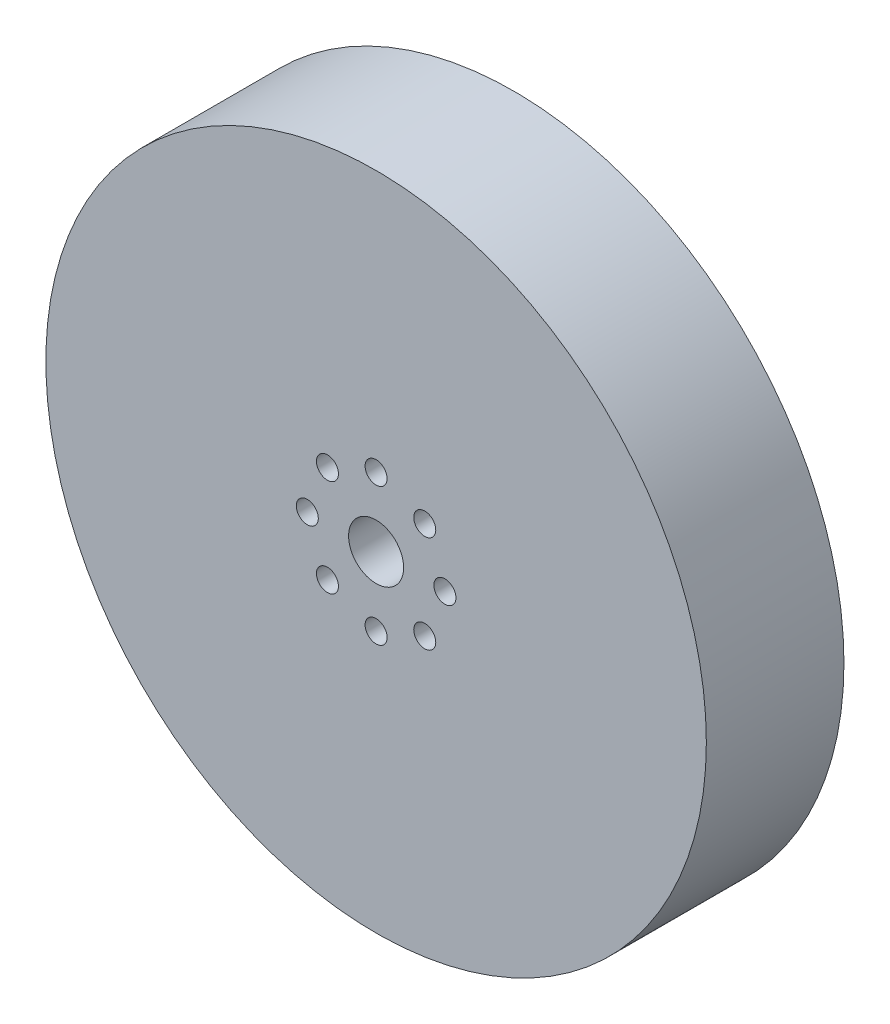
ISO-10303-21;
HEADER;
FILE_DESCRIPTION(('STEP AP214'),'2;1');
FILE_NAME('part.step','',(''),(''),'','','');
FILE_SCHEMA(('AUTOMOTIVE_DESIGN { 1 0 10303 214 1 1 1 1 }'));
ENDSEC;
DATA;
#1=APPLICATION_CONTEXT('core data for automotive mechanical design processes');
#2=APPLICATION_PROTOCOL_DEFINITION('international standard','automotive_design',2000,#1);
#3=PRODUCT_CONTEXT('',#1,'mechanical');
#4=PRODUCT('Part','Part','',(#3));
#5=PRODUCT_RELATED_PRODUCT_CATEGORY('part','',(#4));
#6=PRODUCT_DEFINITION_FORMATION('','',#4);
#7=PRODUCT_DEFINITION_CONTEXT('part definition',#1,'design');
#8=PRODUCT_DEFINITION('design','',#6,#7);
#9=PRODUCT_DEFINITION_SHAPE('','',#8);
#10=(LENGTH_UNIT() NAMED_UNIT(*) SI_UNIT(.MILLI.,.METRE.));
#11=(NAMED_UNIT(*) PLANE_ANGLE_UNIT() SI_UNIT($,.RADIAN.));
#12=(NAMED_UNIT(*) SI_UNIT($,.STERADIAN.) SOLID_ANGLE_UNIT());
#13=UNCERTAINTY_MEASURE_WITH_UNIT(LENGTH_MEASURE(1.E-05),#10,'distance_accuracy_value','');
#14=(GEOMETRIC_REPRESENTATION_CONTEXT(3) GLOBAL_UNCERTAINTY_ASSIGNED_CONTEXT((#13)) GLOBAL_UNIT_ASSIGNED_CONTEXT((#10,
#11,#12)) REPRESENTATION_CONTEXT('',''));
#15=CARTESIAN_POINT('',(0.,0.,0.));
#16=DIRECTION('',(0.,0.,1.));
#17=DIRECTION('',(1.,0.,0.));
#18=AXIS2_PLACEMENT_3D('',#15,#16,#17);
#19=CARTESIAN_POINT('',(0.,0.,20.));
#20=DIRECTION('',(0.,0.,-1.));
#21=DIRECTION('',(-1.,0.,0.));
#22=AXIS2_PLACEMENT_3D('',#19,#20,#21);
#23=CYLINDRICAL_SURFACE('',#22,48.);
#24=CARTESIAN_POINT('',(0.,0.,20.));
#25=DIRECTION('',(0.,0.,1.));
#26=DIRECTION('',(1.,0.,0.));
#27=AXIS2_PLACEMENT_3D('',#24,#25,#26);
#28=CIRCLE('',#27,48.);
#29=CARTESIAN_POINT('',(48.,0.,20.));
#30=VERTEX_POINT('',#29);
#31=EDGE_CURVE('E10',#30,#30,#28,.T.);
#32=ORIENTED_EDGE('',*,*,#31,.F.);
#33=EDGE_LOOP('',(#32));
#34=FACE_BOUND('',#33,.T.);
#35=CARTESIAN_POINT('',(0.,0.,0.));
#36=DIRECTION('',(0.,0.,1.));
#37=DIRECTION('',(1.,0.,0.));
#38=AXIS2_PLACEMENT_3D('',#35,#36,#37);
#39=CIRCLE('',#38,48.);
#40=CARTESIAN_POINT('',(48.,0.,0.));
#41=VERTEX_POINT('',#40);
#42=EDGE_CURVE('E34',#41,#41,#39,.T.);
#43=ORIENTED_EDGE('',*,*,#42,.T.);
#44=EDGE_LOOP('',(#43));
#45=FACE_BOUND('',#44,.T.);
#46=ADVANCED_FACE('F31',(#34,#45),#23,.T.);
#47=CARTESIAN_POINT('',(0.,0.,20.));
#48=DIRECTION('',(0.,0.,1.));
#49=DIRECTION('',(1.,0.,0.));
#50=AXIS2_PLACEMENT_3D('',#47,#48,#49);
#51=PLANE('',#50);
#52=CARTESIAN_POINT('',(0.,10.,20.));
#53=DIRECTION('',(0.,0.,1.));
#54=DIRECTION('',(1.,0.,0.));
#55=AXIS2_PLACEMENT_3D('',#52,#53,#54);
#56=CIRCLE('',#55,1.6);
#57=CARTESIAN_POINT('',(1.6,10.,20.));
#58=VERTEX_POINT('',#57);
#59=EDGE_CURVE('E68',#58,#58,#56,.F.);
#60=ORIENTED_EDGE('',*,*,#59,.T.);
#61=EDGE_LOOP('',(#60));
#62=FACE_BOUND('',#61,.T.);
#63=CARTESIAN_POINT('',(-7.07106781186563,7.07106781186584,20.));
#64=DIRECTION('',(0.,0.,1.));
#65=DIRECTION('',(1.,0.,0.));
#66=AXIS2_PLACEMENT_3D('',#63,#64,#65);
#67=CIRCLE('',#66,1.6);
#68=CARTESIAN_POINT('',(-5.47106781186562,7.07106781186584,20.));
#69=VERTEX_POINT('',#68);
#70=EDGE_CURVE('E62',#69,#69,#67,.F.);
#71=ORIENTED_EDGE('',*,*,#70,.T.);
#72=EDGE_LOOP('',(#71));
#73=FACE_BOUND('',#72,.T.);
#74=CARTESIAN_POINT('',(-10.0000000000005,5.16132801497635E-13,20.));
#75=DIRECTION('',(0.,0.,1.));
#76=DIRECTION('',(1.,0.,0.));
#77=AXIS2_PLACEMENT_3D('',#74,#75,#76);
#78=CIRCLE('',#77,1.6);
#79=CARTESIAN_POINT('',(-8.40000000000051,5.16132801497635E-13,20.));
#80=VERTEX_POINT('',#79);
#81=EDGE_CURVE('E56',#80,#80,#78,.F.);
#82=ORIENTED_EDGE('',*,*,#81,.T.);
#83=EDGE_LOOP('',(#82));
#84=FACE_BOUND('',#83,.T.);
#85=CARTESIAN_POINT('',(-7.07106781186636,-7.07106781186511,20.));
#86=DIRECTION('',(0.,0.,1.));
#87=DIRECTION('',(1.,0.,0.));
#88=AXIS2_PLACEMENT_3D('',#85,#86,#87);
#89=CIRCLE('',#88,1.6);
#90=CARTESIAN_POINT('',(-5.47106781186636,-7.07106781186511,20.));
#91=VERTEX_POINT('',#90);
#92=EDGE_CURVE('E49',#91,#91,#89,.F.);
#93=ORIENTED_EDGE('',*,*,#92,.T.);
#94=EDGE_LOOP('',(#93));
#95=FACE_BOUND('',#94,.T.);
#96=CARTESIAN_POINT('',(-1.03226560299527E-12,-10.,20.));
#97=DIRECTION('',(0.,0.,1.));
#98=DIRECTION('',(1.,0.,0.));
#99=AXIS2_PLACEMENT_3D('',#96,#97,#98);
#100=CIRCLE('',#99,1.6);
#101=CARTESIAN_POINT('',(1.59999999999897,-10.,20.));
#102=VERTEX_POINT('',#101);
#103=EDGE_CURVE('E91',#102,#102,#100,.F.);
#104=ORIENTED_EDGE('',*,*,#103,.T.);
#105=EDGE_LOOP('',(#104));
#106=FACE_BOUND('',#105,.T.);
#107=CARTESIAN_POINT('',(7.0710678118646,-7.07106781186584,20.));
#108=DIRECTION('',(0.,0.,1.));
#109=DIRECTION('',(1.,0.,0.));
#110=AXIS2_PLACEMENT_3D('',#107,#108,#109);
#111=CIRCLE('',#110,1.6);
#112=CARTESIAN_POINT('',(8.67106781186459,-7.07106781186584,20.));
#113=VERTEX_POINT('',#112);
#114=EDGE_CURVE('E85',#113,#113,#111,.F.);
#115=ORIENTED_EDGE('',*,*,#114,.T.);
#116=EDGE_LOOP('',(#115));
#117=FACE_BOUND('',#116,.T.);
#118=CARTESIAN_POINT('',(9.99999999999948,-5.17357448296783E-13,20.));
#119=DIRECTION('',(0.,0.,1.));
#120=DIRECTION('',(1.,0.,0.));
#121=AXIS2_PLACEMENT_3D('',#118,#119,#120);
#122=CIRCLE('',#121,1.6);
#123=CARTESIAN_POINT('',(11.5999999999995,-5.17357448296783E-13,20.));
#124=VERTEX_POINT('',#123);
#125=EDGE_CURVE('E79',#124,#124,#122,.F.);
#126=ORIENTED_EDGE('',*,*,#125,.T.);
#127=EDGE_LOOP('',(#126));
#128=FACE_BOUND('',#127,.T.);
#129=CARTESIAN_POINT('',(7.07106781186533,7.07106781186511,20.));
#130=DIRECTION('',(0.,0.,1.));
#131=DIRECTION('',(1.,0.,0.));
#132=AXIS2_PLACEMENT_3D('',#129,#130,#131);
#133=CIRCLE('',#132,1.6);
#134=CARTESIAN_POINT('',(8.67106781186533,7.07106781186511,20.));
#135=VERTEX_POINT('',#134);
#136=EDGE_CURVE('E73',#135,#135,#133,.F.);
#137=ORIENTED_EDGE('',*,*,#136,.T.);
#138=EDGE_LOOP('',(#137));
#139=FACE_BOUND('',#138,.T.);
#140=CARTESIAN_POINT('',(0.,0.,20.));
#141=DIRECTION('',(0.,0.,1.));
#142=DIRECTION('',(1.,0.,0.));
#143=AXIS2_PLACEMENT_3D('',#140,#141,#142);
#144=CIRCLE('',#143,4.);
#145=CARTESIAN_POINT('',(4.,0.,20.));
#146=VERTEX_POINT('',#145);
#147=EDGE_CURVE('E43',#146,#146,#144,.F.);
#148=ORIENTED_EDGE('',*,*,#147,.T.);
#149=EDGE_LOOP('',(#148));
#150=FACE_BOUND('',#149,.T.);
#151=ORIENTED_EDGE('',*,*,#31,.T.);
#152=EDGE_LOOP('',(#151));
#153=FACE_BOUND('',#152,.T.);
#154=ADVANCED_FACE('F103',(#62,#73,#84,#95,#106,#117,#128,#139,#150,#153),#51,.T.);
#155=CARTESIAN_POINT('',(0.,0.,0.));
#156=DIRECTION('',(0.,0.,1.));
#157=DIRECTION('',(1.,0.,0.));
#158=AXIS2_PLACEMENT_3D('',#155,#156,#157);
#159=PLANE('',#158);
#160=CARTESIAN_POINT('',(0.,10.,0.));
#161=DIRECTION('',(0.,0.,-1.));
#162=DIRECTION('',(-1.,0.,0.));
#163=AXIS2_PLACEMENT_3D('',#160,#161,#162);
#164=CIRCLE('',#163,1.6);
#165=CARTESIAN_POINT('',(-1.6,10.,0.));
#166=VERTEX_POINT('',#165);
#167=EDGE_CURVE('E46',#166,#166,#164,.T.);
#168=ORIENTED_EDGE('',*,*,#167,.F.);
#169=EDGE_LOOP('',(#168));
#170=FACE_BOUND('',#169,.T.);
#171=CARTESIAN_POINT('',(-7.07106781186563,7.07106781186584,0.));
#172=DIRECTION('',(0.,0.,-1.));
#173=DIRECTION('',(-1.,0.,0.));
#174=AXIS2_PLACEMENT_3D('',#171,#172,#173);
#175=CIRCLE('',#174,1.6);
#176=CARTESIAN_POINT('',(-8.67106781186563,7.07106781186584,0.));
#177=VERTEX_POINT('',#176);
#178=EDGE_CURVE('E65',#177,#177,#175,.T.);
#179=ORIENTED_EDGE('',*,*,#178,.F.);
#180=EDGE_LOOP('',(#179));
#181=FACE_BOUND('',#180,.T.);
#182=CARTESIAN_POINT('',(-10.0000000000005,5.16132801497635E-13,0.));
#183=DIRECTION('',(0.,0.,-1.));
#184=DIRECTION('',(-1.,0.,0.));
#185=AXIS2_PLACEMENT_3D('',#182,#183,#184);
#186=CIRCLE('',#185,1.6);
#187=CARTESIAN_POINT('',(-11.6000000000005,5.16132801497635E-13,0.));
#188=VERTEX_POINT('',#187);
#189=EDGE_CURVE('E59',#188,#188,#186,.T.);
#190=ORIENTED_EDGE('',*,*,#189,.F.);
#191=EDGE_LOOP('',(#190));
#192=FACE_BOUND('',#191,.T.);
#193=CARTESIAN_POINT('',(-7.07106781186636,-7.07106781186511,0.));
#194=DIRECTION('',(0.,0.,-1.));
#195=DIRECTION('',(-1.,0.,0.));
#196=AXIS2_PLACEMENT_3D('',#193,#194,#195);
#197=CIRCLE('',#196,1.6);
#198=CARTESIAN_POINT('',(-8.67106781186636,-7.07106781186511,0.));
#199=VERTEX_POINT('',#198);
#200=EDGE_CURVE('E52',#199,#199,#197,.T.);
#201=ORIENTED_EDGE('',*,*,#200,.F.);
#202=EDGE_LOOP('',(#201));
#203=FACE_BOUND('',#202,.T.);
#204=CARTESIAN_POINT('',(-1.03226560299527E-12,-10.,0.));
#205=DIRECTION('',(0.,0.,-1.));
#206=DIRECTION('',(-1.,0.,0.));
#207=AXIS2_PLACEMENT_3D('',#204,#205,#206);
#208=CIRCLE('',#207,1.6);
#209=CARTESIAN_POINT('',(-1.60000000000103,-10.,0.));
#210=VERTEX_POINT('',#209);
#211=EDGE_CURVE('E53',#210,#210,#208,.T.);
#212=ORIENTED_EDGE('',*,*,#211,.F.);
#213=EDGE_LOOP('',(#212));
#214=FACE_BOUND('',#213,.T.);
#215=CARTESIAN_POINT('',(7.0710678118646,-7.07106781186584,0.));
#216=DIRECTION('',(0.,0.,-1.));
#217=DIRECTION('',(-1.,0.,0.));
#218=AXIS2_PLACEMENT_3D('',#215,#216,#217);
#219=CIRCLE('',#218,1.6);
#220=CARTESIAN_POINT('',(5.4710678118646,-7.07106781186584,0.));
#221=VERTEX_POINT('',#220);
#222=EDGE_CURVE('E88',#221,#221,#219,.T.);
#223=ORIENTED_EDGE('',*,*,#222,.F.);
#224=EDGE_LOOP('',(#223));
#225=FACE_BOUND('',#224,.T.);
#226=CARTESIAN_POINT('',(9.99999999999948,-5.17357448296783E-13,0.));
#227=DIRECTION('',(0.,0.,-1.));
#228=DIRECTION('',(-1.,0.,0.));
#229=AXIS2_PLACEMENT_3D('',#226,#227,#228);
#230=CIRCLE('',#229,1.6);
#231=CARTESIAN_POINT('',(8.39999999999948,-5.17357448296783E-13,0.));
#232=VERTEX_POINT('',#231);
#233=EDGE_CURVE('E82',#232,#232,#230,.T.);
#234=ORIENTED_EDGE('',*,*,#233,.F.);
#235=EDGE_LOOP('',(#234));
#236=FACE_BOUND('',#235,.T.);
#237=CARTESIAN_POINT('',(7.07106781186533,7.07106781186511,0.));
#238=DIRECTION('',(0.,0.,-1.));
#239=DIRECTION('',(-1.,0.,0.));
#240=AXIS2_PLACEMENT_3D('',#237,#238,#239);
#241=CIRCLE('',#240,1.6);
#242=CARTESIAN_POINT('',(5.47106781186533,7.07106781186511,0.));
#243=VERTEX_POINT('',#242);
#244=EDGE_CURVE('E76',#243,#243,#241,.T.);
#245=ORIENTED_EDGE('',*,*,#244,.F.);
#246=EDGE_LOOP('',(#245));
#247=FACE_BOUND('',#246,.T.);
#248=CARTESIAN_POINT('',(0.,0.,0.));
#249=DIRECTION('',(0.,0.,-1.));
#250=DIRECTION('',(-1.,0.,0.));
#251=AXIS2_PLACEMENT_3D('',#248,#249,#250);
#252=CIRCLE('',#251,4.);
#253=CARTESIAN_POINT('',(-4.,0.,0.));
#254=VERTEX_POINT('',#253);
#255=EDGE_CURVE('E41',#254,#254,#252,.T.);
#256=ORIENTED_EDGE('',*,*,#255,.F.);
#257=EDGE_LOOP('',(#256));
#258=FACE_BOUND('',#257,.T.);
#259=ORIENTED_EDGE('',*,*,#42,.F.);
#260=EDGE_LOOP('',(#259));
#261=FACE_BOUND('',#260,.T.);
#262=ADVANCED_FACE('F99',(#170,#181,#192,#203,#214,#225,#236,#247,#258,#261),#159,.F.);
#263=CARTESIAN_POINT('',(0.,0.,20.001));
#264=DIRECTION('',(0.,0.,-1.));
#265=DIRECTION('',(-1.,0.,0.));
#266=AXIS2_PLACEMENT_3D('',#263,#264,#265);
#267=CYLINDRICAL_SURFACE('',#266,4.);
#268=ORIENTED_EDGE('',*,*,#147,.F.);
#269=EDGE_LOOP('',(#268));
#270=FACE_BOUND('',#269,.T.);
#271=ORIENTED_EDGE('',*,*,#255,.T.);
#272=EDGE_LOOP('',(#271));
#273=FACE_BOUND('',#272,.T.);
#274=ADVANCED_FACE('F102',(#270,#273),#267,.F.);
#275=CARTESIAN_POINT('',(7.07106781186533,7.07106781186511,20.001));
#276=DIRECTION('',(0.,0.,-1.));
#277=DIRECTION('',(-1.,0.,0.));
#278=AXIS2_PLACEMENT_3D('',#275,#276,#277);
#279=CYLINDRICAL_SURFACE('',#278,1.6);
#280=ORIENTED_EDGE('',*,*,#136,.F.);
#281=EDGE_LOOP('',(#280));
#282=FACE_BOUND('',#281,.T.);
#283=ORIENTED_EDGE('',*,*,#244,.T.);
#284=EDGE_LOOP('',(#283));
#285=FACE_BOUND('',#284,.T.);
#286=ADVANCED_FACE('F128',(#282,#285),#279,.F.);
#287=CARTESIAN_POINT('',(9.99999999999948,-5.17357448296783E-13,20.001));
#288=DIRECTION('',(0.,0.,-1.));
#289=DIRECTION('',(-1.,0.,0.));
#290=AXIS2_PLACEMENT_3D('',#287,#288,#289);
#291=CYLINDRICAL_SURFACE('',#290,1.6);
#292=ORIENTED_EDGE('',*,*,#125,.F.);
#293=EDGE_LOOP('',(#292));
#294=FACE_BOUND('',#293,.T.);
#295=ORIENTED_EDGE('',*,*,#233,.T.);
#296=EDGE_LOOP('',(#295));
#297=FACE_BOUND('',#296,.T.);
#298=ADVANCED_FACE('F148',(#294,#297),#291,.F.);
#299=CARTESIAN_POINT('',(7.0710678118646,-7.07106781186584,20.001));
#300=DIRECTION('',(0.,0.,-1.));
#301=DIRECTION('',(-1.,0.,0.));
#302=AXIS2_PLACEMENT_3D('',#299,#300,#301);
#303=CYLINDRICAL_SURFACE('',#302,1.6);
#304=ORIENTED_EDGE('',*,*,#114,.F.);
#305=EDGE_LOOP('',(#304));
#306=FACE_BOUND('',#305,.T.);
#307=ORIENTED_EDGE('',*,*,#222,.T.);
#308=EDGE_LOOP('',(#307));
#309=FACE_BOUND('',#308,.T.);
#310=ADVANCED_FACE('F152',(#306,#309),#303,.F.);
#311=CARTESIAN_POINT('',(-1.03226560299527E-12,-10.,20.001));
#312=DIRECTION('',(0.,0.,-1.));
#313=DIRECTION('',(-1.,0.,0.));
#314=AXIS2_PLACEMENT_3D('',#311,#312,#313);
#315=CYLINDRICAL_SURFACE('',#314,1.6);
#316=ORIENTED_EDGE('',*,*,#103,.F.);
#317=EDGE_LOOP('',(#316));
#318=FACE_BOUND('',#317,.T.);
#319=ORIENTED_EDGE('',*,*,#211,.T.);
#320=EDGE_LOOP('',(#319));
#321=FACE_BOUND('',#320,.T.);
#322=ADVANCED_FACE('F97',(#318,#321),#315,.F.);
#323=CARTESIAN_POINT('',(-7.07106781186636,-7.07106781186511,20.001));
#324=DIRECTION('',(0.,0.,-1.));
#325=DIRECTION('',(-1.,0.,0.));
#326=AXIS2_PLACEMENT_3D('',#323,#324,#325);
#327=CYLINDRICAL_SURFACE('',#326,1.6);
#328=ORIENTED_EDGE('',*,*,#92,.F.);
#329=EDGE_LOOP('',(#328));
#330=FACE_BOUND('',#329,.T.);
#331=ORIENTED_EDGE('',*,*,#200,.T.);
#332=EDGE_LOOP('',(#331));
#333=FACE_BOUND('',#332,.T.);
#334=ADVANCED_FACE('F130',(#330,#333),#327,.F.);
#335=CARTESIAN_POINT('',(-10.0000000000005,5.16132801497635E-13,20.001));
#336=DIRECTION('',(0.,0.,-1.));
#337=DIRECTION('',(-1.,0.,0.));
#338=AXIS2_PLACEMENT_3D('',#335,#336,#337);
#339=CYLINDRICAL_SURFACE('',#338,1.6);
#340=ORIENTED_EDGE('',*,*,#81,.F.);
#341=EDGE_LOOP('',(#340));
#342=FACE_BOUND('',#341,.T.);
#343=ORIENTED_EDGE('',*,*,#189,.T.);
#344=EDGE_LOOP('',(#343));
#345=FACE_BOUND('',#344,.T.);
#346=ADVANCED_FACE('F133',(#342,#345),#339,.F.);
#347=CARTESIAN_POINT('',(-7.07106781186563,7.07106781186584,20.001));
#348=DIRECTION('',(0.,0.,-1.));
#349=DIRECTION('',(-1.,0.,0.));
#350=AXIS2_PLACEMENT_3D('',#347,#348,#349);
#351=CYLINDRICAL_SURFACE('',#350,1.6);
#352=ORIENTED_EDGE('',*,*,#70,.F.);
#353=EDGE_LOOP('',(#352));
#354=FACE_BOUND('',#353,.T.);
#355=ORIENTED_EDGE('',*,*,#178,.T.);
#356=EDGE_LOOP('',(#355));
#357=FACE_BOUND('',#356,.T.);
#358=ADVANCED_FACE('F137',(#354,#357),#351,.F.);
#359=CARTESIAN_POINT('',(0.,10.,20.001));
#360=DIRECTION('',(0.,0.,-1.));
#361=DIRECTION('',(-1.,0.,0.));
#362=AXIS2_PLACEMENT_3D('',#359,#360,#361);
#363=CYLINDRICAL_SURFACE('',#362,1.6);
#364=ORIENTED_EDGE('',*,*,#59,.F.);
#365=EDGE_LOOP('',(#364));
#366=FACE_BOUND('',#365,.T.);
#367=ORIENTED_EDGE('',*,*,#167,.T.);
#368=EDGE_LOOP('',(#367));
#369=FACE_BOUND('',#368,.T.);
#370=ADVANCED_FACE('F141',(#366,#369),#363,.F.);
#371=CLOSED_SHELL('',(#46,#154,#262,#274,#286,#298,#310,#322,#334,#346,#358,#370));
#372=MANIFOLD_SOLID_BREP('B2',#371);
#373=ADVANCED_BREP_SHAPE_REPRESENTATION('',(#18,#372),#14);
#374=SHAPE_DEFINITION_REPRESENTATION(#9,#373);
ENDSEC;
END-ISO-10303-21;
